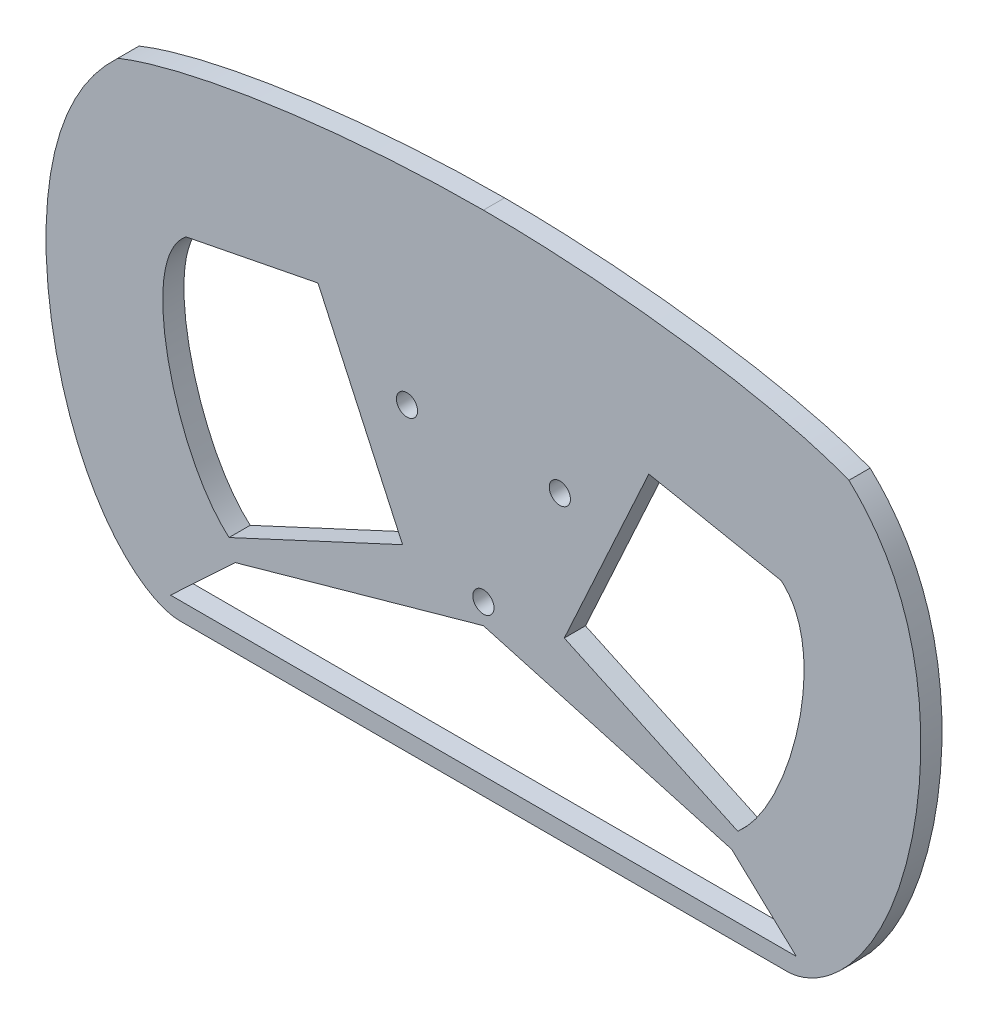
ISO-10303-21;
HEADER;
FILE_DESCRIPTION(('STEP AP214'),'2;1');
FILE_NAME('part.step','',(''),(''),'','','');
FILE_SCHEMA(('AUTOMOTIVE_DESIGN { 1 0 10303 214 1 1 1 1 }'));
ENDSEC;
DATA;
#1=APPLICATION_CONTEXT('core data for automotive mechanical design processes');
#2=APPLICATION_PROTOCOL_DEFINITION('international standard','automotive_design',2000,#1);
#3=PRODUCT_CONTEXT('',#1,'mechanical');
#4=PRODUCT('Part','Part','',(#3));
#5=PRODUCT_RELATED_PRODUCT_CATEGORY('part','',(#4));
#6=PRODUCT_DEFINITION_FORMATION('','',#4);
#7=PRODUCT_DEFINITION_CONTEXT('part definition',#1,'design');
#8=PRODUCT_DEFINITION('design','',#6,#7);
#9=PRODUCT_DEFINITION_SHAPE('','',#8);
#10=(LENGTH_UNIT() NAMED_UNIT(*) SI_UNIT(.MILLI.,.METRE.));
#11=(NAMED_UNIT(*) PLANE_ANGLE_UNIT() SI_UNIT($,.RADIAN.));
#12=(NAMED_UNIT(*) SI_UNIT($,.STERADIAN.) SOLID_ANGLE_UNIT());
#13=UNCERTAINTY_MEASURE_WITH_UNIT(LENGTH_MEASURE(1.E-05),#10,'distance_accuracy_value','');
#14=(GEOMETRIC_REPRESENTATION_CONTEXT(3) GLOBAL_UNCERTAINTY_ASSIGNED_CONTEXT((#13)) GLOBAL_UNIT_ASSIGNED_CONTEXT((#10,
#11,#12)) REPRESENTATION_CONTEXT('',''));
#15=CARTESIAN_POINT('',(0.,0.,0.));
#16=DIRECTION('',(0.,0.,1.));
#17=DIRECTION('',(1.,0.,0.));
#18=AXIS2_PLACEMENT_3D('',#15,#16,#17);
#19=CARTESIAN_POINT('',(-57.4067035098367,67.1601433163897,6.));
#20=DIRECTION('',(0.,0.,-1.));
#21=DIRECTION('',(-1.,0.,0.));
#22=AXIS2_PLACEMENT_3D('',#19,#20,#21);
#23=PLANE('',#22);
#24=DIRECTION('',(-0.730258070634001,0.683171391580405,0.));
#25=VECTOR('',#24,1.);
#26=CARTESIAN_POINT('',(88.6306413725891,-67.6586968253069,6.));
#27=LINE('',#26,#25);
#28=CARTESIAN_POINT('',(88.6306413725891,-67.6586968253069,6.));
#29=VERTEX_POINT('',#28);
#30=CARTESIAN_POINT('',(70.3039660217103,-50.5137164327831,6.));
#31=VERTEX_POINT('',#30);
#32=EDGE_CURVE('E203',#29,#31,#27,.T.);
#33=ORIENTED_EDGE('',*,*,#32,.F.);
#34=DIRECTION('',(1.,0.,0.));
#35=VECTOR('',#34,1.);
#36=CARTESIAN_POINT('',(-88.6306413725891,-67.6586968253069,6.));
#37=LINE('',#36,#35);
#38=CARTESIAN_POINT('',(-88.6306413725891,-67.6586968253069,6.));
#39=VERTEX_POINT('',#38);
#40=EDGE_CURVE('E213',#39,#29,#37,.T.);
#41=ORIENTED_EDGE('',*,*,#40,.F.);
#42=DIRECTION('',(-0.730258070634001,-0.683171391580405,0.));
#43=VECTOR('',#42,1.);
#44=CARTESIAN_POINT('',(-88.6306413725891,-67.6586968253069,6.));
#45=LINE('',#44,#43);
#46=CARTESIAN_POINT('',(-70.3039660217103,-50.5137164327831,6.));
#47=VERTEX_POINT('',#46);
#48=EDGE_CURVE('E210',#47,#39,#45,.T.);
#49=ORIENTED_EDGE('',*,*,#48,.F.);
#50=DIRECTION('',(-0.963015451934841,-0.269446171497638,0.));
#51=VECTOR('',#50,1.);
#52=CARTESIAN_POINT('',(-70.3039660217103,-50.5137164327831,6.));
#53=LINE('',#52,#51);
#54=CARTESIAN_POINT('',(0.,-30.8430720546579,6.));
#55=VERTEX_POINT('',#54);
#56=EDGE_CURVE('E208',#55,#47,#53,.T.);
#57=ORIENTED_EDGE('',*,*,#56,.F.);
#58=DIRECTION('',(-0.963015451934841,0.269446171497638,0.));
#59=VECTOR('',#58,1.);
#60=CARTESIAN_POINT('',(70.3039660217103,-50.5137164327831,6.));
#61=LINE('',#60,#59);
#62=EDGE_CURVE('E205',#31,#55,#61,.T.);
#63=ORIENTED_EDGE('',*,*,#62,.F.);
#64=EDGE_LOOP('',(#33,#41,#49,#57,#63));
#65=FACE_BOUND('',#64,.T.);
#66=CARTESIAN_POINT('',(0.,-25.,6.));
#67=DIRECTION('',(0.,0.,1.));
#68=DIRECTION('',(1.,0.,0.));
#69=AXIS2_PLACEMENT_3D('',#66,#67,#68);
#70=CIRCLE('',#69,3.);
#71=CARTESIAN_POINT('',(3.,-25.,6.));
#72=VERTEX_POINT('',#71);
#73=EDGE_CURVE('E580',#72,#72,#70,.T.);
#74=ORIENTED_EDGE('',*,*,#73,.F.);
#75=EDGE_LOOP('',(#74));
#76=FACE_BOUND('',#75,.T.);
#77=CARTESIAN_POINT('',(21.650635094611,12.5,6.));
#78=DIRECTION('',(0.,0.,1.));
#79=DIRECTION('',(1.,0.,0.));
#80=AXIS2_PLACEMENT_3D('',#77,#78,#79);
#81=CIRCLE('',#80,3.00000000000001);
#82=CARTESIAN_POINT('',(24.650635094611,12.5,6.));
#83=VERTEX_POINT('',#82);
#84=EDGE_CURVE('E584',#83,#83,#81,.T.);
#85=ORIENTED_EDGE('',*,*,#84,.F.);
#86=EDGE_LOOP('',(#85));
#87=FACE_BOUND('',#86,.T.);
#88=CARTESIAN_POINT('',(-21.650635094611,12.5,6.));
#89=DIRECTION('',(0.,0.,1.));
#90=DIRECTION('',(1.,0.,0.));
#91=AXIS2_PLACEMENT_3D('',#88,#89,#90);
#92=CIRCLE('',#91,3.00000000000001);
#93=CARTESIAN_POINT('',(-18.650635094611,12.5,6.));
#94=VERTEX_POINT('',#93);
#95=EDGE_CURVE('E307',#94,#94,#92,.T.);
#96=ORIENTED_EDGE('',*,*,#95,.F.);
#97=EDGE_LOOP('',(#96));
#98=FACE_BOUND('',#97,.T.);
#99=CARTESIAN_POINT('',(0.,71.1085408069992,6.));
#100=CARTESIAN_POINT('',(-37.0664149320864,71.1085408069992,6.));
#101=CARTESIAN_POINT('',(-81.5060778589243,65.4160886680611,6.));
#102=CARTESIAN_POINT('',(-103.536149705662,56.5987172989374,6.));
#103=B_SPLINE_CURVE_WITH_KNOTS('',3,(#99,#100,#101,#102),.UNSPECIFIED.,.F.,.F.,(4,4),(0.,1.),.UNSPECIFIED.);
#104=CARTESIAN_POINT('',(0.,71.1085408069992,6.));
#105=VERTEX_POINT('',#104);
#106=CARTESIAN_POINT('',(-103.536149705662,56.5987172989374,6.));
#107=VERTEX_POINT('',#106);
#108=EDGE_CURVE('E330',#105,#107,#103,.T.);
#109=ORIENTED_EDGE('',*,*,#108,.T.);
#110=CARTESIAN_POINT('',(-103.536149705662,56.5987172989374,6.));
#111=CARTESIAN_POINT('',(-134.530875024596,27.8149090652724,6.));
#112=CARTESIAN_POINT('',(-125.262371043548,-15.2801345413315,6.));
#113=CARTESIAN_POINT('',(-123.105866617516,-50.1204502558757,6.));
#114=CARTESIAN_POINT('',(-99.7807620493416,-72.6586968253069,6.));
#115=CARTESIAN_POINT('',(-85.9501201183242,-72.6586968253069,6.));
#116=B_SPLINE_CURVE_WITH_KNOTS('',5,(#110,#111,#112,#113,#114,#115),.UNSPECIFIED.,.F.,.F.,(6,6),
(0.,1.),.UNSPECIFIED.);
#117=CARTESIAN_POINT('',(-85.9501201183242,-72.6586968253069,6.));
#118=VERTEX_POINT('',#117);
#119=EDGE_CURVE('E365',#107,#118,#116,.T.);
#120=ORIENTED_EDGE('',*,*,#119,.T.);
#121=DIRECTION('',(1.,0.,0.));
#122=VECTOR('',#121,1.);
#123=CARTESIAN_POINT('',(-85.9501201183242,-72.6586968253069,6.));
#124=LINE('',#123,#122);
#125=CARTESIAN_POINT('',(85.9501201183242,-72.6586968253069,6.));
#126=VERTEX_POINT('',#125);
#127=EDGE_CURVE('E348',#118,#126,#124,.T.);
#128=ORIENTED_EDGE('',*,*,#127,.T.);
#129=CARTESIAN_POINT('',(85.9501201183242,-72.6586968253069,6.));
#130=CARTESIAN_POINT('',(99.7807620493416,-72.6586968253069,6.));
#131=CARTESIAN_POINT('',(123.105866617516,-50.1204502558757,6.));
#132=CARTESIAN_POINT('',(125.262371043548,-15.2801345413315,6.));
#133=CARTESIAN_POINT('',(134.530875024596,27.8149090652724,6.));
#134=CARTESIAN_POINT('',(103.536149705662,56.5987172989374,6.));
#135=B_SPLINE_CURVE_WITH_KNOTS('',5,(#129,#130,#131,#132,#133,#134),.UNSPECIFIED.,.F.,.F.,(6,6),
(0.,1.),.UNSPECIFIED.);
#136=CARTESIAN_POINT('',(103.536149705662,56.5987172989374,6.));
#137=VERTEX_POINT('',#136);
#138=EDGE_CURVE('E293',#126,#137,#135,.T.);
#139=ORIENTED_EDGE('',*,*,#138,.T.);
#140=CARTESIAN_POINT('',(103.536149705662,56.5987172989374,6.));
#141=CARTESIAN_POINT('',(81.5060778589243,65.4160886680611,6.));
#142=CARTESIAN_POINT('',(37.0664149320864,71.1085408069992,6.));
#143=CARTESIAN_POINT('',(0.,71.1085408069992,6.));
#144=B_SPLINE_CURVE_WITH_KNOTS('',3,(#140,#141,#142,#143),.UNSPECIFIED.,.F.,.F.,(4,4),(0.,1.),.UNSPECIFIED.);
#145=EDGE_CURVE('E287',#137,#105,#144,.T.);
#146=ORIENTED_EDGE('',*,*,#145,.T.);
#147=EDGE_LOOP('',(#109,#120,#128,#139,#146));
#148=FACE_BOUND('',#147,.T.);
#149=CARTESIAN_POINT('',(72.0640331123577,-45.2447002517224,6.));
#150=CARTESIAN_POINT('',(84.4709812280167,-34.4539182941937,6.));
#151=CARTESIAN_POINT('',(91.9413727094764,-10.618598610413,6.));
#152=CARTESIAN_POINT('',(95.4544804612851,13.3648448196854,6.));
#153=CARTESIAN_POINT('',(84.2711836093656,22.4211546285655,6.));
#154=B_SPLINE_CURVE_WITH_KNOTS('',4,(#149,#150,#151,#152,#153),.UNSPECIFIED.,.F.,.F.,(5,5),(0.,
1.),.UNSPECIFIED.);
#155=CARTESIAN_POINT('',(72.0640331123577,-45.2447002517224,6.));
#156=VERTEX_POINT('',#155);
#157=CARTESIAN_POINT('',(84.2711836093656,22.4211546285655,6.));
#158=VERTEX_POINT('',#157);
#159=EDGE_CURVE('E241',#156,#158,#154,.T.);
#160=ORIENTED_EDGE('',*,*,#159,.F.);
#161=DIRECTION('',(0.906996454750081,-0.421138256479728,0.));
#162=VECTOR('',#161,1.);
#163=CARTESIAN_POINT('',(22.9040285405314,-22.4186368140003,6.));
#164=LINE('',#163,#162);
#165=CARTESIAN_POINT('',(22.9040285405314,-22.4186368140003,6.));
#166=VERTEX_POINT('',#165);
#167=EDGE_CURVE('E609',#166,#156,#164,.T.);
#168=ORIENTED_EDGE('',*,*,#167,.F.);
#169=DIRECTION('',(-0.416934771026848,-0.908936409606739,0.));
#170=VECTOR('',#169,1.);
#171=CARTESIAN_POINT('',(46.8501625452164,29.7850040878488,6.));
#172=LINE('',#171,#170);
#173=CARTESIAN_POINT('',(46.8501625452164,29.7850040878488,6.));
#174=VERTEX_POINT('',#173);
#175=EDGE_CURVE('E625',#174,#166,#172,.T.);
#176=ORIENTED_EDGE('',*,*,#175,.F.);
#177=DIRECTION('',(-0.981182848874633,0.193080856312219,0.));
#178=VECTOR('',#177,1.);
#179=CARTESIAN_POINT('',(84.2711836093656,22.4211546285655,6.));
#180=LINE('',#179,#178);
#181=EDGE_CURVE('E246',#158,#174,#180,.T.);
#182=ORIENTED_EDGE('',*,*,#181,.F.);
#183=EDGE_LOOP('',(#160,#168,#176,#182));
#184=FACE_BOUND('',#183,.T.);
#185=CARTESIAN_POINT('',(-84.2711836093656,22.4211546285655,6.));
#186=CARTESIAN_POINT('',(-95.4544804612851,13.3648448196854,6.));
#187=CARTESIAN_POINT('',(-91.9413727094764,-10.618598610413,6.));
#188=CARTESIAN_POINT('',(-84.4709812280167,-34.4539182941937,6.));
#189=CARTESIAN_POINT('',(-72.0640331123577,-45.2447002517224,6.));
#190=B_SPLINE_CURVE_WITH_KNOTS('',4,(#185,#186,#187,#188,#189),.UNSPECIFIED.,.F.,.F.,(5,5),(0.,
1.),.UNSPECIFIED.);
#191=CARTESIAN_POINT('',(-84.2711836093656,22.4211546285655,6.));
#192=VERTEX_POINT('',#191);
#193=CARTESIAN_POINT('',(-72.0640331123577,-45.2447002517224,6.));
#194=VERTEX_POINT('',#193);
#195=EDGE_CURVE('E159',#192,#194,#190,.T.);
#196=ORIENTED_EDGE('',*,*,#195,.F.);
#197=DIRECTION('',(-0.981182848874633,-0.193080856312219,0.));
#198=VECTOR('',#197,1.);
#199=CARTESIAN_POINT('',(-84.2711836093656,22.4211546285655,6.));
#200=LINE('',#199,#198);
#201=CARTESIAN_POINT('',(-46.8501625452164,29.7850040878488,6.));
#202=VERTEX_POINT('',#201);
#203=EDGE_CURVE('E181',#202,#192,#200,.T.);
#204=ORIENTED_EDGE('',*,*,#203,.F.);
#205=DIRECTION('',(-0.416934771026848,0.908936409606739,0.));
#206=VECTOR('',#205,1.);
#207=CARTESIAN_POINT('',(-46.8501625452164,29.7850040878488,6.));
#208=LINE('',#207,#206);
#209=CARTESIAN_POINT('',(-22.9040285405314,-22.4186368140003,6.));
#210=VERTEX_POINT('',#209);
#211=EDGE_CURVE('E179',#210,#202,#208,.T.);
#212=ORIENTED_EDGE('',*,*,#211,.F.);
#213=DIRECTION('',(0.906996454750081,0.421138256479728,0.));
#214=VECTOR('',#213,1.);
#215=CARTESIAN_POINT('',(-22.9040285405314,-22.4186368140003,6.));
#216=LINE('',#215,#214);
#217=EDGE_CURVE('E167',#194,#210,#216,.T.);
#218=ORIENTED_EDGE('',*,*,#217,.F.);
#219=EDGE_LOOP('',(#196,#204,#212,#218));
#220=FACE_BOUND('',#219,.T.);
#221=ADVANCED_FACE('F33',(#65,#76,#87,#98,#148,#184,#220),#23,.F.);
#222=CARTESIAN_POINT('',(-57.4067035098367,67.1601433163897,0.));
#223=DIRECTION('',(0.,0.,-1.));
#224=DIRECTION('',(-1.,0.,0.));
#225=AXIS2_PLACEMENT_3D('',#222,#223,#224);
#226=PLANE('',#225);
#227=CARTESIAN_POINT('',(21.650635094611,12.5,0.));
#228=DIRECTION('',(0.,0.,1.));
#229=DIRECTION('',(1.,0.,0.));
#230=AXIS2_PLACEMENT_3D('',#227,#228,#229);
#231=CIRCLE('',#230,3.00000000000001);
#232=CARTESIAN_POINT('',(24.650635094611,12.5,0.));
#233=VERTEX_POINT('',#232);
#234=EDGE_CURVE('E591',#233,#233,#231,.T.);
#235=ORIENTED_EDGE('',*,*,#234,.T.);
#236=EDGE_LOOP('',(#235));
#237=FACE_BOUND('',#236,.T.);
#238=CARTESIAN_POINT('',(0.,71.1085408069992,0.));
#239=CARTESIAN_POINT('',(-37.0664149320864,71.1085408069992,0.));
#240=CARTESIAN_POINT('',(-81.5060778589243,65.4160886680611,0.));
#241=CARTESIAN_POINT('',(-103.536149705662,56.5987172989374,0.));
#242=B_SPLINE_CURVE_WITH_KNOTS('',3,(#238,#239,#240,#241),.UNSPECIFIED.,.F.,.F.,(4,4),(0.,1.),.UNSPECIFIED.);
#243=CARTESIAN_POINT('',(0.,71.1085408069992,0.));
#244=VERTEX_POINT('',#243);
#245=CARTESIAN_POINT('',(-103.536149705662,56.5987172989374,0.));
#246=VERTEX_POINT('',#245);
#247=EDGE_CURVE('E298',#244,#246,#242,.T.);
#248=ORIENTED_EDGE('',*,*,#247,.F.);
#249=CARTESIAN_POINT('',(103.536149705662,56.5987172989374,0.));
#250=CARTESIAN_POINT('',(81.5060778589243,65.4160886680611,0.));
#251=CARTESIAN_POINT('',(37.0664149320864,71.1085408069992,0.));
#252=CARTESIAN_POINT('',(0.,71.1085408069992,0.));
#253=B_SPLINE_CURVE_WITH_KNOTS('',3,(#249,#250,#251,#252),.UNSPECIFIED.,.F.,.F.,(4,4),(0.,1.),.UNSPECIFIED.);
#254=CARTESIAN_POINT('',(103.536149705662,56.5987172989374,0.));
#255=VERTEX_POINT('',#254);
#256=EDGE_CURVE('E323',#255,#244,#253,.T.);
#257=ORIENTED_EDGE('',*,*,#256,.F.);
#258=CARTESIAN_POINT('',(85.9501201183242,-72.6586968253069,0.));
#259=CARTESIAN_POINT('',(99.7807620493416,-72.6586968253069,0.));
#260=CARTESIAN_POINT('',(123.105866617516,-50.1204502558757,0.));
#261=CARTESIAN_POINT('',(125.262371043548,-15.2801345413315,0.));
#262=CARTESIAN_POINT('',(134.530875024596,27.8149090652724,0.));
#263=CARTESIAN_POINT('',(103.536149705662,56.5987172989374,0.));
#264=B_SPLINE_CURVE_WITH_KNOTS('',5,(#258,#259,#260,#261,#262,#263),.UNSPECIFIED.,.F.,.F.,(6,6),
(0.,1.),.UNSPECIFIED.);
#265=CARTESIAN_POINT('',(85.9501201183242,-72.6586968253069,0.));
#266=VERTEX_POINT('',#265);
#267=EDGE_CURVE('E319',#266,#255,#264,.T.);
#268=ORIENTED_EDGE('',*,*,#267,.F.);
#269=DIRECTION('',(1.,0.,0.));
#270=VECTOR('',#269,1.);
#271=CARTESIAN_POINT('',(-85.9501201183242,-72.6586968253069,0.));
#272=LINE('',#271,#270);
#273=CARTESIAN_POINT('',(-85.9501201183242,-72.6586968253069,0.));
#274=VERTEX_POINT('',#273);
#275=EDGE_CURVE('E314',#274,#266,#272,.T.);
#276=ORIENTED_EDGE('',*,*,#275,.F.);
#277=CARTESIAN_POINT('',(-103.536149705662,56.5987172989374,0.));
#278=CARTESIAN_POINT('',(-134.530875024596,27.8149090652724,0.));
#279=CARTESIAN_POINT('',(-125.262371043548,-15.2801345413315,0.));
#280=CARTESIAN_POINT('',(-123.105866617516,-50.1204502558757,0.));
#281=CARTESIAN_POINT('',(-99.7807620493416,-72.6586968253069,0.));
#282=CARTESIAN_POINT('',(-85.9501201183242,-72.6586968253069,0.));
#283=B_SPLINE_CURVE_WITH_KNOTS('',5,(#277,#278,#279,#280,#281,#282),.UNSPECIFIED.,.F.,.F.,(6,6),
(0.,1.),.UNSPECIFIED.);
#284=EDGE_CURVE('E306',#246,#274,#283,.T.);
#285=ORIENTED_EDGE('',*,*,#284,.F.);
#286=EDGE_LOOP('',(#248,#257,#268,#276,#285));
#287=FACE_BOUND('',#286,.T.);
#288=CARTESIAN_POINT('',(-21.650635094611,12.5,0.));
#289=DIRECTION('',(0.,0.,1.));
#290=DIRECTION('',(1.,0.,0.));
#291=AXIS2_PLACEMENT_3D('',#288,#289,#290);
#292=CIRCLE('',#291,3.00000000000001);
#293=CARTESIAN_POINT('',(-18.650635094611,12.5,0.));
#294=VERTEX_POINT('',#293);
#295=EDGE_CURVE('E587',#294,#294,#292,.T.);
#296=ORIENTED_EDGE('',*,*,#295,.T.);
#297=EDGE_LOOP('',(#296));
#298=FACE_BOUND('',#297,.T.);
#299=CARTESIAN_POINT('',(0.,-25.,0.));
#300=DIRECTION('',(0.,0.,1.));
#301=DIRECTION('',(1.,0.,0.));
#302=AXIS2_PLACEMENT_3D('',#299,#300,#301);
#303=CIRCLE('',#302,3.);
#304=CARTESIAN_POINT('',(3.,-25.,0.));
#305=VERTEX_POINT('',#304);
#306=EDGE_CURVE('E595',#305,#305,#303,.T.);
#307=ORIENTED_EDGE('',*,*,#306,.T.);
#308=EDGE_LOOP('',(#307));
#309=FACE_BOUND('',#308,.T.);
#310=DIRECTION('',(0.906996454750081,-0.421138256479728,0.));
#311=VECTOR('',#310,1.);
#312=CARTESIAN_POINT('',(22.9040285405314,-22.4186368140003,0.));
#313=LINE('',#312,#311);
#314=CARTESIAN_POINT('',(22.9040285405314,-22.4186368140003,0.));
#315=VERTEX_POINT('',#314);
#316=CARTESIAN_POINT('',(72.0640331123577,-45.2447002517224,0.));
#317=VERTEX_POINT('',#316);
#318=EDGE_CURVE('E247',#315,#317,#313,.T.);
#319=ORIENTED_EDGE('',*,*,#318,.T.);
#320=CARTESIAN_POINT('',(72.0640331123577,-45.2447002517224,0.));
#321=CARTESIAN_POINT('',(84.4709812280167,-34.4539182941937,0.));
#322=CARTESIAN_POINT('',(91.9413727094764,-10.618598610413,0.));
#323=CARTESIAN_POINT('',(95.4544804612851,13.3648448196854,0.));
#324=CARTESIAN_POINT('',(84.2711836093656,22.4211546285655,0.));
#325=B_SPLINE_CURVE_WITH_KNOTS('',4,(#320,#321,#322,#323,#324),.UNSPECIFIED.,.F.,.F.,(5,5),(0.,
1.),.UNSPECIFIED.);
#326=CARTESIAN_POINT('',(84.2711836093656,22.4211546285655,0.));
#327=VERTEX_POINT('',#326);
#328=EDGE_CURVE('E240',#317,#327,#325,.T.);
#329=ORIENTED_EDGE('',*,*,#328,.T.);
#330=DIRECTION('',(-0.981182848874633,0.193080856312219,0.));
#331=VECTOR('',#330,1.);
#332=CARTESIAN_POINT('',(84.2711836093656,22.4211546285655,0.));
#333=LINE('',#332,#331);
#334=CARTESIAN_POINT('',(46.8501625452164,29.7850040878488,0.));
#335=VERTEX_POINT('',#334);
#336=EDGE_CURVE('E615',#327,#335,#333,.T.);
#337=ORIENTED_EDGE('',*,*,#336,.T.);
#338=DIRECTION('',(-0.416934771026848,-0.908936409606739,0.));
#339=VECTOR('',#338,1.);
#340=CARTESIAN_POINT('',(46.8501625452164,29.7850040878488,0.));
#341=LINE('',#340,#339);
#342=EDGE_CURVE('E612',#335,#315,#341,.T.);
#343=ORIENTED_EDGE('',*,*,#342,.T.);
#344=EDGE_LOOP('',(#319,#329,#337,#343));
#345=FACE_BOUND('',#344,.T.);
#346=DIRECTION('',(1.,0.,0.));
#347=VECTOR('',#346,1.);
#348=CARTESIAN_POINT('',(-88.6306413725891,-67.6586968253069,0.));
#349=LINE('',#348,#347);
#350=CARTESIAN_POINT('',(-88.6306413725891,-67.6586968253069,0.));
#351=VERTEX_POINT('',#350);
#352=CARTESIAN_POINT('',(88.6306413725891,-67.6586968253069,0.));
#353=VERTEX_POINT('',#352);
#354=EDGE_CURVE('E206',#351,#353,#349,.T.);
#355=ORIENTED_EDGE('',*,*,#354,.T.);
#356=DIRECTION('',(-0.730258070634001,0.683171391580405,0.));
#357=VECTOR('',#356,1.);
#358=CARTESIAN_POINT('',(88.6306413725891,-67.6586968253069,0.));
#359=LINE('',#358,#357);
#360=CARTESIAN_POINT('',(70.3039660217103,-50.5137164327831,0.));
#361=VERTEX_POINT('',#360);
#362=EDGE_CURVE('E175',#353,#361,#359,.T.);
#363=ORIENTED_EDGE('',*,*,#362,.T.);
#364=DIRECTION('',(-0.963015451934841,0.269446171497638,0.));
#365=VECTOR('',#364,1.);
#366=CARTESIAN_POINT('',(70.3039660217103,-50.5137164327831,0.));
#367=LINE('',#366,#365);
#368=CARTESIAN_POINT('',(0.,-30.8430720546579,0.));
#369=VERTEX_POINT('',#368);
#370=EDGE_CURVE('E218',#361,#369,#367,.T.);
#371=ORIENTED_EDGE('',*,*,#370,.T.);
#372=DIRECTION('',(-0.963015451934841,-0.269446171497638,0.));
#373=VECTOR('',#372,1.);
#374=CARTESIAN_POINT('',(-70.3039660217103,-50.5137164327831,0.));
#375=LINE('',#374,#373);
#376=CARTESIAN_POINT('',(-70.3039660217103,-50.5137164327831,0.));
#377=VERTEX_POINT('',#376);
#378=EDGE_CURVE('E221',#369,#377,#375,.T.);
#379=ORIENTED_EDGE('',*,*,#378,.T.);
#380=DIRECTION('',(-0.730258070634001,-0.683171391580405,0.));
#381=VECTOR('',#380,1.);
#382=CARTESIAN_POINT('',(-88.6306413725891,-67.6586968253069,0.));
#383=LINE('',#382,#381);
#384=EDGE_CURVE('E224',#377,#351,#383,.T.);
#385=ORIENTED_EDGE('',*,*,#384,.T.);
#386=EDGE_LOOP('',(#355,#363,#371,#379,#385));
#387=FACE_BOUND('',#386,.T.);
#388=DIRECTION('',(-0.981182848874633,-0.193080856312219,0.));
#389=VECTOR('',#388,1.);
#390=CARTESIAN_POINT('',(-84.2711836093656,22.4211546285655,0.));
#391=LINE('',#390,#389);
#392=CARTESIAN_POINT('',(-46.8501625452164,29.7850040878488,0.));
#393=VERTEX_POINT('',#392);
#394=CARTESIAN_POINT('',(-84.2711836093656,22.4211546285655,0.));
#395=VERTEX_POINT('',#394);
#396=EDGE_CURVE('E168',#393,#395,#391,.T.);
#397=ORIENTED_EDGE('',*,*,#396,.T.);
#398=CARTESIAN_POINT('',(-84.2711836093656,22.4211546285655,0.));
#399=CARTESIAN_POINT('',(-95.4544804612851,13.3648448196854,0.));
#400=CARTESIAN_POINT('',(-91.9413727094764,-10.618598610413,0.));
#401=CARTESIAN_POINT('',(-84.4709812280167,-34.4539182941937,0.));
#402=CARTESIAN_POINT('',(-72.0640331123577,-45.2447002517224,0.));
#403=B_SPLINE_CURVE_WITH_KNOTS('',4,(#398,#399,#400,#401,#402),.UNSPECIFIED.,.F.,.F.,(5,5),(0.,
1.),.UNSPECIFIED.);
#404=CARTESIAN_POINT('',(-72.0640331123577,-45.2447002517224,0.));
#405=VERTEX_POINT('',#404);
#406=EDGE_CURVE('E57',#395,#405,#403,.T.);
#407=ORIENTED_EDGE('',*,*,#406,.T.);
#408=DIRECTION('',(0.906996454750081,0.421138256479728,0.));
#409=VECTOR('',#408,1.);
#410=CARTESIAN_POINT('',(-22.9040285405314,-22.4186368140003,0.));
#411=LINE('',#410,#409);
#412=CARTESIAN_POINT('',(-22.9040285405314,-22.4186368140003,0.));
#413=VERTEX_POINT('',#412);
#414=EDGE_CURVE('E174',#405,#413,#411,.T.);
#415=ORIENTED_EDGE('',*,*,#414,.T.);
#416=DIRECTION('',(-0.416934771026848,0.908936409606739,0.));
#417=VECTOR('',#416,1.);
#418=CARTESIAN_POINT('',(-46.8501625452164,29.7850040878488,0.));
#419=LINE('',#418,#417);
#420=EDGE_CURVE('E195',#413,#393,#419,.T.);
#421=ORIENTED_EDGE('',*,*,#420,.T.);
#422=EDGE_LOOP('',(#397,#407,#415,#421));
#423=FACE_BOUND('',#422,.T.);
#424=ADVANCED_FACE('F275',(#237,#287,#298,#309,#345,#387,#423),#226,.T.);
#425=DIRECTION('',(0.,0.,-1.));
#426=VECTOR('',#425,1.);
#427=SURFACE_OF_LINEAR_EXTRUSION('',#103,#426);
#428=ORIENTED_EDGE('',*,*,#247,.T.);
#429=DIRECTION('',(0.,0.,-1.));
#430=VECTOR('',#429,1.);
#431=CARTESIAN_POINT('',(-103.536149705662,56.5987172989374,6.));
#432=LINE('',#431,#430);
#433=EDGE_CURVE('E11',#107,#246,#432,.T.);
#434=ORIENTED_EDGE('',*,*,#433,.F.);
#435=ORIENTED_EDGE('',*,*,#108,.F.);
#436=DIRECTION('',(0.,0.,-1.));
#437=VECTOR('',#436,1.);
#438=CARTESIAN_POINT('',(0.,71.1085408069992,6.));
#439=LINE('',#438,#437);
#440=EDGE_CURVE('E292',#105,#244,#439,.T.);
#441=ORIENTED_EDGE('',*,*,#440,.T.);
#442=EDGE_LOOP('',(#428,#434,#435,#441));
#443=FACE_BOUND('',#442,.T.);
#444=ADVANCED_FACE('F35',(#443),#427,.F.);
#445=DIRECTION('',(0.,0.,-1.));
#446=VECTOR('',#445,1.);
#447=SURFACE_OF_LINEAR_EXTRUSION('',#116,#446);
#448=ORIENTED_EDGE('',*,*,#284,.T.);
#449=DIRECTION('',(0.,0.,-1.));
#450=VECTOR('',#449,1.);
#451=CARTESIAN_POINT('',(-85.9501201183242,-72.6586968253069,6.));
#452=LINE('',#451,#450);
#453=EDGE_CURVE('E42',#118,#274,#452,.T.);
#454=ORIENTED_EDGE('',*,*,#453,.F.);
#455=ORIENTED_EDGE('',*,*,#119,.F.);
#456=ORIENTED_EDGE('',*,*,#433,.T.);
#457=EDGE_LOOP('',(#448,#454,#455,#456));
#458=FACE_BOUND('',#457,.T.);
#459=ADVANCED_FACE('F377',(#458),#447,.F.);
#460=CARTESIAN_POINT('',(-85.9501201183242,-72.6586968253069,6.));
#461=DIRECTION('',(0.,1.,0.));
#462=DIRECTION('',(0.,0.,1.));
#463=AXIS2_PLACEMENT_3D('',#460,#461,#462);
#464=PLANE('',#463);
#465=ORIENTED_EDGE('',*,*,#275,.T.);
#466=DIRECTION('',(0.,0.,-1.));
#467=VECTOR('',#466,1.);
#468=CARTESIAN_POINT('',(85.9501201183242,-72.6586968253069,6.));
#469=LINE('',#468,#467);
#470=EDGE_CURVE('E339',#126,#266,#469,.T.);
#471=ORIENTED_EDGE('',*,*,#470,.F.);
#472=ORIENTED_EDGE('',*,*,#127,.F.);
#473=ORIENTED_EDGE('',*,*,#453,.T.);
#474=EDGE_LOOP('',(#465,#471,#472,#473));
#475=FACE_BOUND('',#474,.T.);
#476=ADVANCED_FACE('F346',(#475),#464,.F.);
#477=DIRECTION('',(0.,0.,-1.));
#478=VECTOR('',#477,1.);
#479=SURFACE_OF_LINEAR_EXTRUSION('',#135,#478);
#480=ORIENTED_EDGE('',*,*,#267,.T.);
#481=DIRECTION('',(0.,0.,-1.));
#482=VECTOR('',#481,1.);
#483=CARTESIAN_POINT('',(103.536149705662,56.5987172989374,6.));
#484=LINE('',#483,#482);
#485=EDGE_CURVE('E336',#137,#255,#484,.T.);
#486=ORIENTED_EDGE('',*,*,#485,.F.);
#487=ORIENTED_EDGE('',*,*,#138,.F.);
#488=ORIENTED_EDGE('',*,*,#470,.T.);
#489=EDGE_LOOP('',(#480,#486,#487,#488));
#490=FACE_BOUND('',#489,.T.);
#491=ADVANCED_FACE('F283',(#490),#479,.F.);
#492=DIRECTION('',(0.,0.,-1.));
#493=VECTOR('',#492,1.);
#494=SURFACE_OF_LINEAR_EXTRUSION('',#144,#493);
#495=ORIENTED_EDGE('',*,*,#256,.T.);
#496=ORIENTED_EDGE('',*,*,#440,.F.);
#497=ORIENTED_EDGE('',*,*,#145,.F.);
#498=ORIENTED_EDGE('',*,*,#485,.T.);
#499=EDGE_LOOP('',(#495,#496,#497,#498));
#500=FACE_BOUND('',#499,.T.);
#501=ADVANCED_FACE('F271',(#500),#494,.F.);
#502=CARTESIAN_POINT('',(-21.650635094611,12.5,6.));
#503=DIRECTION('',(0.,0.,-1.));
#504=DIRECTION('',(-1.,0.,0.));
#505=AXIS2_PLACEMENT_3D('',#502,#503,#504);
#506=CYLINDRICAL_SURFACE('',#505,3.00000000000001);
#507=ORIENTED_EDGE('',*,*,#95,.T.);
#508=EDGE_LOOP('',(#507));
#509=FACE_BOUND('',#508,.T.);
#510=ORIENTED_EDGE('',*,*,#295,.F.);
#511=EDGE_LOOP('',(#510));
#512=FACE_BOUND('',#511,.T.);
#513=ADVANCED_FACE('F267',(#509,#512),#506,.F.);
#514=CARTESIAN_POINT('',(21.650635094611,12.5,6.));
#515=DIRECTION('',(0.,0.,-1.));
#516=DIRECTION('',(-1.,0.,0.));
#517=AXIS2_PLACEMENT_3D('',#514,#515,#516);
#518=CYLINDRICAL_SURFACE('',#517,3.00000000000001);
#519=ORIENTED_EDGE('',*,*,#84,.T.);
#520=EDGE_LOOP('',(#519));
#521=FACE_BOUND('',#520,.T.);
#522=ORIENTED_EDGE('',*,*,#234,.F.);
#523=EDGE_LOOP('',(#522));
#524=FACE_BOUND('',#523,.T.);
#525=ADVANCED_FACE('F263',(#521,#524),#518,.F.);
#526=CARTESIAN_POINT('',(0.,-25.,6.));
#527=DIRECTION('',(0.,0.,-1.));
#528=DIRECTION('',(-1.,0.,0.));
#529=AXIS2_PLACEMENT_3D('',#526,#527,#528);
#530=CYLINDRICAL_SURFACE('',#529,3.);
#531=ORIENTED_EDGE('',*,*,#73,.T.);
#532=EDGE_LOOP('',(#531));
#533=FACE_BOUND('',#532,.T.);
#534=ORIENTED_EDGE('',*,*,#306,.F.);
#535=EDGE_LOOP('',(#534));
#536=FACE_BOUND('',#535,.T.);
#537=ADVANCED_FACE('F258',(#533,#536),#530,.F.);
#538=DIRECTION('',(0.,0.,-1.));
#539=VECTOR('',#538,1.);
#540=SURFACE_OF_LINEAR_EXTRUSION('',#154,#539);
#541=ORIENTED_EDGE('',*,*,#328,.F.);
#542=DIRECTION('',(0.,0.,-1.));
#543=VECTOR('',#542,1.);
#544=CARTESIAN_POINT('',(72.0640331123577,-45.2447002517224,6.));
#545=LINE('',#544,#543);
#546=EDGE_CURVE('E606',#156,#317,#545,.T.);
#547=ORIENTED_EDGE('',*,*,#546,.F.);
#548=ORIENTED_EDGE('',*,*,#159,.T.);
#549=DIRECTION('',(0.,0.,-1.));
#550=VECTOR('',#549,1.);
#551=CARTESIAN_POINT('',(84.2711836093656,22.4211546285655,6.));
#552=LINE('',#551,#550);
#553=EDGE_CURVE('E598',#158,#327,#552,.T.);
#554=ORIENTED_EDGE('',*,*,#553,.T.);
#555=EDGE_LOOP('',(#541,#547,#548,#554));
#556=FACE_BOUND('',#555,.T.);
#557=ADVANCED_FACE('F253',(#556),#540,.T.);
#558=CARTESIAN_POINT('',(84.2711836093656,22.4211546285655,6.));
#559=DIRECTION('',(-0.193080856312219,-0.981182848874633,0.));
#560=DIRECTION('',(0.981182848874633,-0.193080856312219,0.));
#561=AXIS2_PLACEMENT_3D('',#558,#559,#560);
#562=PLANE('',#561);
#563=ORIENTED_EDGE('',*,*,#336,.F.);
#564=ORIENTED_EDGE('',*,*,#553,.F.);
#565=ORIENTED_EDGE('',*,*,#181,.T.);
#566=DIRECTION('',(0.,0.,-1.));
#567=VECTOR('',#566,1.);
#568=CARTESIAN_POINT('',(46.8501625452164,29.7850040878488,6.));
#569=LINE('',#568,#567);
#570=EDGE_CURVE('E602',#174,#335,#569,.T.);
#571=ORIENTED_EDGE('',*,*,#570,.T.);
#572=EDGE_LOOP('',(#563,#564,#565,#571));
#573=FACE_BOUND('',#572,.T.);
#574=ADVANCED_FACE('F257',(#573),#562,.T.);
#575=CARTESIAN_POINT('',(46.8501625452164,29.7850040878488,6.));
#576=DIRECTION('',(0.908936409606739,-0.416934771026848,0.));
#577=DIRECTION('',(0.416934771026848,0.908936409606739,0.));
#578=AXIS2_PLACEMENT_3D('',#575,#576,#577);
#579=PLANE('',#578);
#580=ORIENTED_EDGE('',*,*,#342,.F.);
#581=ORIENTED_EDGE('',*,*,#570,.F.);
#582=ORIENTED_EDGE('',*,*,#175,.T.);
#583=DIRECTION('',(0.,0.,-1.));
#584=VECTOR('',#583,1.);
#585=CARTESIAN_POINT('',(22.9040285405314,-22.4186368140003,6.));
#586=LINE('',#585,#584);
#587=EDGE_CURVE('E604',#166,#315,#586,.T.);
#588=ORIENTED_EDGE('',*,*,#587,.T.);
#589=EDGE_LOOP('',(#580,#581,#582,#588));
#590=FACE_BOUND('',#589,.T.);
#591=ADVANCED_FACE('F411',(#590),#579,.T.);
#592=CARTESIAN_POINT('',(22.9040285405314,-22.4186368140003,6.));
#593=DIRECTION('',(0.421138256479728,0.906996454750081,0.));
#594=DIRECTION('',(-0.906996454750081,0.421138256479728,0.));
#595=AXIS2_PLACEMENT_3D('',#592,#593,#594);
#596=PLANE('',#595);
#597=ORIENTED_EDGE('',*,*,#318,.F.);
#598=ORIENTED_EDGE('',*,*,#587,.F.);
#599=ORIENTED_EDGE('',*,*,#167,.T.);
#600=ORIENTED_EDGE('',*,*,#546,.T.);
#601=EDGE_LOOP('',(#597,#598,#599,#600));
#602=FACE_BOUND('',#601,.T.);
#603=ADVANCED_FACE('F418',(#602),#596,.T.);
#604=CARTESIAN_POINT('',(88.6306413725891,-67.6586968253069,6.));
#605=DIRECTION('',(-0.683171391580404,-0.730258070634001,0.));
#606=DIRECTION('',(0.730258070634001,-0.683171391580405,0.));
#607=AXIS2_PLACEMENT_3D('',#604,#605,#606);
#608=PLANE('',#607);
#609=ORIENTED_EDGE('',*,*,#362,.F.);
#610=DIRECTION('',(0.,0.,-1.));
#611=VECTOR('',#610,1.);
#612=CARTESIAN_POINT('',(88.6306413725891,-67.6586968253069,6.));
#613=LINE('',#612,#611);
#614=EDGE_CURVE('E215',#29,#353,#613,.T.);
#615=ORIENTED_EDGE('',*,*,#614,.F.);
#616=ORIENTED_EDGE('',*,*,#32,.T.);
#617=DIRECTION('',(0.,0.,-1.));
#618=VECTOR('',#617,1.);
#619=CARTESIAN_POINT('',(70.3039660217103,-50.5137164327831,6.));
#620=LINE('',#619,#618);
#621=EDGE_CURVE('E237',#31,#361,#620,.T.);
#622=ORIENTED_EDGE('',*,*,#621,.T.);
#623=EDGE_LOOP('',(#609,#615,#616,#622));
#624=FACE_BOUND('',#623,.T.);
#625=ADVANCED_FACE('F425',(#624),#608,.T.);
#626=CARTESIAN_POINT('',(70.3039660217103,-50.5137164327831,6.));
#627=DIRECTION('',(-0.269446171497638,-0.963015451934841,0.));
#628=DIRECTION('',(0.963015451934841,-0.269446171497638,0.));
#629=AXIS2_PLACEMENT_3D('',#626,#627,#628);
#630=PLANE('',#629);
#631=ORIENTED_EDGE('',*,*,#370,.F.);
#632=ORIENTED_EDGE('',*,*,#621,.F.);
#633=ORIENTED_EDGE('',*,*,#62,.T.);
#634=DIRECTION('',(0.,0.,-1.));
#635=VECTOR('',#634,1.);
#636=CARTESIAN_POINT('',(0.,-30.8430720546579,6.));
#637=LINE('',#636,#635);
#638=EDGE_CURVE('E235',#55,#369,#637,.T.);
#639=ORIENTED_EDGE('',*,*,#638,.T.);
#640=EDGE_LOOP('',(#631,#632,#633,#639));
#641=FACE_BOUND('',#640,.T.);
#642=ADVANCED_FACE('F433',(#641),#630,.T.);
#643=CARTESIAN_POINT('',(-70.3039660217103,-50.5137164327831,6.));
#644=DIRECTION('',(0.269446171497638,-0.963015451934841,0.));
#645=DIRECTION('',(0.963015451934841,0.269446171497638,0.));
#646=AXIS2_PLACEMENT_3D('',#643,#644,#645);
#647=PLANE('',#646);
#648=ORIENTED_EDGE('',*,*,#378,.F.);
#649=ORIENTED_EDGE('',*,*,#638,.F.);
#650=ORIENTED_EDGE('',*,*,#56,.T.);
#651=DIRECTION('',(0.,0.,-1.));
#652=VECTOR('',#651,1.);
#653=CARTESIAN_POINT('',(-70.3039660217103,-50.5137164327831,6.));
#654=LINE('',#653,#652);
#655=EDGE_CURVE('E233',#47,#377,#654,.T.);
#656=ORIENTED_EDGE('',*,*,#655,.T.);
#657=EDGE_LOOP('',(#648,#649,#650,#656));
#658=FACE_BOUND('',#657,.T.);
#659=ADVANCED_FACE('F441',(#658),#647,.T.);
#660=CARTESIAN_POINT('',(-88.6306413725891,-67.6586968253069,6.));
#661=DIRECTION('',(0.683171391580404,-0.730258070634001,0.));
#662=DIRECTION('',(0.730258070634001,0.683171391580405,0.));
#663=AXIS2_PLACEMENT_3D('',#660,#661,#662);
#664=PLANE('',#663);
#665=ORIENTED_EDGE('',*,*,#384,.F.);
#666=ORIENTED_EDGE('',*,*,#655,.F.);
#667=ORIENTED_EDGE('',*,*,#48,.T.);
#668=DIRECTION('',(0.,0.,-1.));
#669=VECTOR('',#668,1.);
#670=CARTESIAN_POINT('',(-88.6306413725891,-67.6586968253069,6.));
#671=LINE('',#670,#669);
#672=EDGE_CURVE('E231',#39,#351,#671,.T.);
#673=ORIENTED_EDGE('',*,*,#672,.T.);
#674=EDGE_LOOP('',(#665,#666,#667,#673));
#675=FACE_BOUND('',#674,.T.);
#676=ADVANCED_FACE('F449',(#675),#664,.T.);
#677=CARTESIAN_POINT('',(-88.6306413725891,-67.6586968253069,6.));
#678=DIRECTION('',(0.,1.,0.));
#679=DIRECTION('',(0.,0.,1.));
#680=AXIS2_PLACEMENT_3D('',#677,#678,#679);
#681=PLANE('',#680);
#682=ORIENTED_EDGE('',*,*,#354,.F.);
#683=ORIENTED_EDGE('',*,*,#672,.F.);
#684=ORIENTED_EDGE('',*,*,#40,.T.);
#685=ORIENTED_EDGE('',*,*,#614,.T.);
#686=EDGE_LOOP('',(#682,#683,#684,#685));
#687=FACE_BOUND('',#686,.T.);
#688=ADVANCED_FACE('F457',(#687),#681,.T.);
#689=DIRECTION('',(0.,0.,-1.));
#690=VECTOR('',#689,1.);
#691=SURFACE_OF_LINEAR_EXTRUSION('',#190,#690);
#692=ORIENTED_EDGE('',*,*,#406,.F.);
#693=DIRECTION('',(0.,0.,-1.));
#694=VECTOR('',#693,1.);
#695=CARTESIAN_POINT('',(-84.2711836093656,22.4211546285655,6.));
#696=LINE('',#695,#694);
#697=EDGE_CURVE('E163',#192,#395,#696,.T.);
#698=ORIENTED_EDGE('',*,*,#697,.F.);
#699=ORIENTED_EDGE('',*,*,#195,.T.);
#700=DIRECTION('',(0.,0.,-1.));
#701=VECTOR('',#700,1.);
#702=CARTESIAN_POINT('',(-72.0640331123577,-45.2447002517224,6.));
#703=LINE('',#702,#701);
#704=EDGE_CURVE('E162',#194,#405,#703,.T.);
#705=ORIENTED_EDGE('',*,*,#704,.T.);
#706=EDGE_LOOP('',(#692,#698,#699,#705));
#707=FACE_BOUND('',#706,.T.);
#708=ADVANCED_FACE('F161',(#707),#691,.T.);
#709=CARTESIAN_POINT('',(-22.9040285405314,-22.4186368140003,6.));
#710=DIRECTION('',(-0.421138256479728,0.906996454750081,0.));
#711=DIRECTION('',(-0.906996454750081,-0.421138256479728,0.));
#712=AXIS2_PLACEMENT_3D('',#709,#710,#711);
#713=PLANE('',#712);
#714=ORIENTED_EDGE('',*,*,#414,.F.);
#715=ORIENTED_EDGE('',*,*,#704,.F.);
#716=ORIENTED_EDGE('',*,*,#217,.T.);
#717=DIRECTION('',(0.,0.,-1.));
#718=VECTOR('',#717,1.);
#719=CARTESIAN_POINT('',(-22.9040285405314,-22.4186368140003,6.));
#720=LINE('',#719,#718);
#721=EDGE_CURVE('E176',#210,#413,#720,.T.);
#722=ORIENTED_EDGE('',*,*,#721,.T.);
#723=EDGE_LOOP('',(#714,#715,#716,#722));
#724=FACE_BOUND('',#723,.T.);
#725=ADVANCED_FACE('F171',(#724),#713,.T.);
#726=CARTESIAN_POINT('',(-46.8501625452164,29.7850040878488,6.));
#727=DIRECTION('',(-0.908936409606739,-0.416934771026848,0.));
#728=DIRECTION('',(0.416934771026848,-0.908936409606739,0.));
#729=AXIS2_PLACEMENT_3D('',#726,#727,#728);
#730=PLANE('',#729);
#731=ORIENTED_EDGE('',*,*,#420,.F.);
#732=ORIENTED_EDGE('',*,*,#721,.F.);
#733=ORIENTED_EDGE('',*,*,#211,.T.);
#734=DIRECTION('',(0.,0.,-1.));
#735=VECTOR('',#734,1.);
#736=CARTESIAN_POINT('',(-46.8501625452164,29.7850040878488,6.));
#737=LINE('',#736,#735);
#738=EDGE_CURVE('E49',#202,#393,#737,.T.);
#739=ORIENTED_EDGE('',*,*,#738,.T.);
#740=EDGE_LOOP('',(#731,#732,#733,#739));
#741=FACE_BOUND('',#740,.T.);
#742=ADVANCED_FACE('F478',(#741),#730,.T.);
#743=CARTESIAN_POINT('',(-84.2711836093656,22.4211546285655,6.));
#744=DIRECTION('',(0.193080856312219,-0.981182848874633,0.));
#745=DIRECTION('',(0.981182848874633,0.193080856312219,0.));
#746=AXIS2_PLACEMENT_3D('',#743,#744,#745);
#747=PLANE('',#746);
#748=ORIENTED_EDGE('',*,*,#396,.F.);
#749=ORIENTED_EDGE('',*,*,#738,.F.);
#750=ORIENTED_EDGE('',*,*,#203,.T.);
#751=ORIENTED_EDGE('',*,*,#697,.T.);
#752=EDGE_LOOP('',(#748,#749,#750,#751));
#753=FACE_BOUND('',#752,.T.);
#754=ADVANCED_FACE('F485',(#753),#747,.T.);
#755=CLOSED_SHELL('',(#221,#424,#444,#459,#476,#491,#501,#513,#525,#537,#557,#574,#591,#603,
#625,#642,#659,#676,#688,#708,#725,#742,#754));
#756=MANIFOLD_SOLID_BREP('B2',#755);
#757=ADVANCED_BREP_SHAPE_REPRESENTATION('',(#18,#756),#14);
#758=SHAPE_DEFINITION_REPRESENTATION(#9,#757);
ENDSEC;
END-ISO-10303-21;
